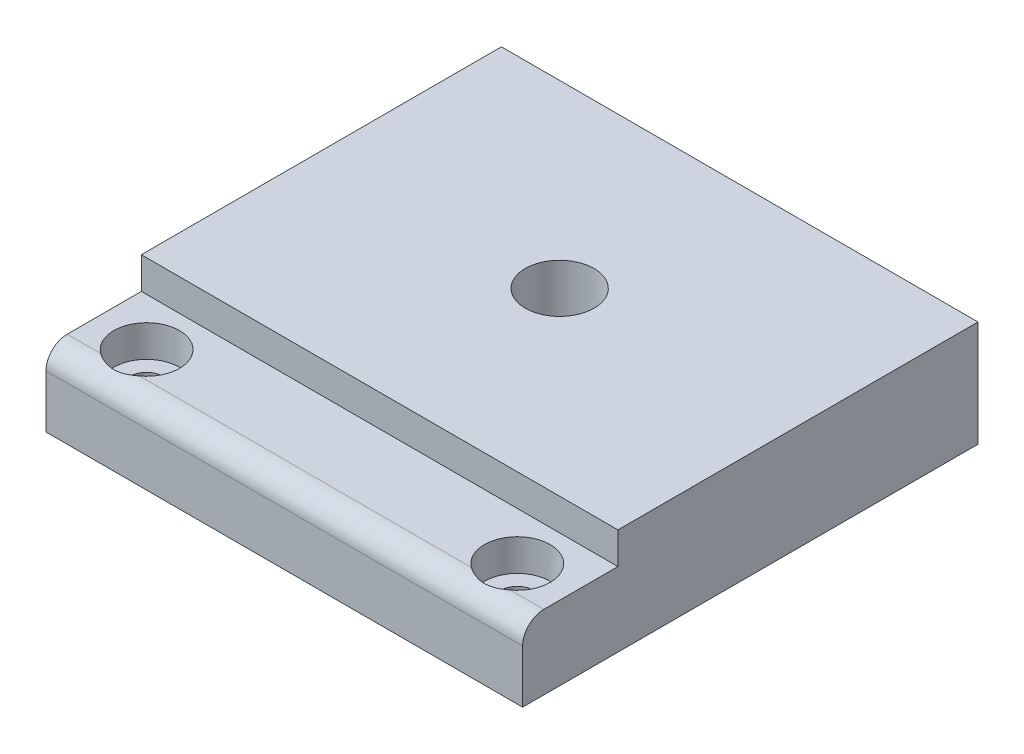
ISO-10303-21;
HEADER;
FILE_DESCRIPTION(('STEP AP214'),'2;1');
FILE_NAME('part.step','',(''),(''),'','','');
FILE_SCHEMA(('AUTOMOTIVE_DESIGN { 1 0 10303 214 1 1 1 1 }'));
ENDSEC;
DATA;
#1=APPLICATION_CONTEXT('core data for automotive mechanical design processes');
#2=APPLICATION_PROTOCOL_DEFINITION('international standard','automotive_design',2000,#1);
#3=PRODUCT_CONTEXT('',#1,'mechanical');
#4=PRODUCT('Part','Part','',(#3));
#5=PRODUCT_RELATED_PRODUCT_CATEGORY('part','',(#4));
#6=PRODUCT_DEFINITION_FORMATION('','',#4);
#7=PRODUCT_DEFINITION_CONTEXT('part definition',#1,'design');
#8=PRODUCT_DEFINITION('design','',#6,#7);
#9=PRODUCT_DEFINITION_SHAPE('','',#8);
#10=(LENGTH_UNIT() NAMED_UNIT(*) SI_UNIT(.MILLI.,.METRE.));
#11=(NAMED_UNIT(*) PLANE_ANGLE_UNIT() SI_UNIT($,.RADIAN.));
#12=(NAMED_UNIT(*) SI_UNIT($,.STERADIAN.) SOLID_ANGLE_UNIT());
#13=UNCERTAINTY_MEASURE_WITH_UNIT(LENGTH_MEASURE(1.E-05),#10,'distance_accuracy_value','');
#14=(GEOMETRIC_REPRESENTATION_CONTEXT(3) GLOBAL_UNCERTAINTY_ASSIGNED_CONTEXT((#13)) GLOBAL_UNIT_ASSIGNED_CONTEXT((#10,
#11,#12)) REPRESENTATION_CONTEXT('',''));
#15=CARTESIAN_POINT('',(0.,0.,0.));
#16=DIRECTION('',(0.,0.,1.));
#17=DIRECTION('',(1.,0.,0.));
#18=AXIS2_PLACEMENT_3D('',#15,#16,#17);
#19=CARTESIAN_POINT('',(40.,-8.50000000000001,8.5));
#20=DIRECTION('',(0.,1.,0.));
#21=DIRECTION('',(-1.,0.,0.));
#22=AXIS2_PLACEMENT_3D('',#19,#20,#21);
#23=CYLINDRICAL_SURFACE('',#22,1.6);
#24=CARTESIAN_POINT('',(40.,-8.50000000000001,8.5));
#25=DIRECTION('',(0.,-1.,0.));
#26=DIRECTION('',(1.,0.,0.));
#27=AXIS2_PLACEMENT_3D('',#24,#25,#26);
#28=CIRCLE('',#27,1.6);
#29=CARTESIAN_POINT('',(41.6,-8.50000000000001,8.5));
#30=VERTEX_POINT('',#29);
#31=EDGE_CURVE('E162',#30,#30,#28,.T.);
#32=ORIENTED_EDGE('',*,*,#31,.T.);
#33=EDGE_LOOP('',(#32));
#34=FACE_BOUND('',#33,.T.);
#35=CARTESIAN_POINT('',(40.,-4.50000000000001,8.5));
#36=DIRECTION('',(0.,1.,0.));
#37=DIRECTION('',(-1.,0.,0.));
#38=AXIS2_PLACEMENT_3D('',#35,#36,#37);
#39=CIRCLE('',#38,1.6);
#40=CARTESIAN_POINT('',(38.4,-4.50000000000001,8.5));
#41=VERTEX_POINT('',#40);
#42=EDGE_CURVE('E186',#41,#41,#39,.T.);
#43=ORIENTED_EDGE('',*,*,#42,.T.);
#44=EDGE_LOOP('',(#43));
#45=FACE_BOUND('',#44,.T.);
#46=ADVANCED_FACE('F39',(#34,#45),#23,.F.);
#47=CARTESIAN_POINT('',(5.,-8.50000000000001,8.5));
#48=DIRECTION('',(0.,1.,0.));
#49=DIRECTION('',(-1.,0.,0.));
#50=AXIS2_PLACEMENT_3D('',#47,#48,#49);
#51=CYLINDRICAL_SURFACE('',#50,1.6);
#52=CARTESIAN_POINT('',(5.,-8.50000000000001,8.5));
#53=DIRECTION('',(0.,-1.,0.));
#54=DIRECTION('',(1.,0.,0.));
#55=AXIS2_PLACEMENT_3D('',#52,#53,#54);
#56=CIRCLE('',#55,1.6);
#57=CARTESIAN_POINT('',(6.6,-8.50000000000001,8.5));
#58=VERTEX_POINT('',#57);
#59=EDGE_CURVE('E159',#58,#58,#56,.T.);
#60=ORIENTED_EDGE('',*,*,#59,.T.);
#61=EDGE_LOOP('',(#60));
#62=FACE_BOUND('',#61,.T.);
#63=CARTESIAN_POINT('',(5.,-4.50000000000001,8.5));
#64=DIRECTION('',(0.,1.,0.));
#65=DIRECTION('',(-1.,0.,0.));
#66=AXIS2_PLACEMENT_3D('',#63,#64,#65);
#67=CIRCLE('',#66,1.6);
#68=CARTESIAN_POINT('',(3.4,-4.50000000000001,8.5));
#69=VERTEX_POINT('',#68);
#70=EDGE_CURVE('E157',#69,#69,#67,.T.);
#71=ORIENTED_EDGE('',*,*,#70,.T.);
#72=EDGE_LOOP('',(#71));
#73=FACE_BOUND('',#72,.T.);
#74=ADVANCED_FACE('F235',(#62,#73),#51,.F.);
#75=CARTESIAN_POINT('',(44.9999999999998,-1.50000000000001,4.));
#76=DIRECTION('',(-1.,0.,0.));
#77=DIRECTION('',(0.,0.,1.));
#78=AXIS2_PLACEMENT_3D('',#75,#76,#77);
#79=PLANE('',#78);
#80=DIRECTION('',(0.,0.,1.));
#81=VECTOR('',#80,1.);
#82=CARTESIAN_POINT('',(45.,-1.50000000000001,0.));
#83=LINE('',#82,#81);
#84=CARTESIAN_POINT('',(44.9999999999998,-1.50000000000001,4.));
#85=VERTEX_POINT('',#84);
#86=CARTESIAN_POINT('',(45.,-1.50000000000001,11.));
#87=VERTEX_POINT('',#86);
#88=EDGE_CURVE('E170',#85,#87,#83,.T.);
#89=ORIENTED_EDGE('',*,*,#88,.T.);
#90=CARTESIAN_POINT('',(44.9999999999998,-3.50000000000001,11.));
#91=DIRECTION('',(-1.,0.,0.));
#92=DIRECTION('',(0.,0.,1.));
#93=AXIS2_PLACEMENT_3D('',#90,#91,#92);
#94=CIRCLE('',#93,2.);
#95=CARTESIAN_POINT('',(45.,-3.50000000000001,13.));
#96=VERTEX_POINT('',#95);
#97=EDGE_CURVE('E11',#87,#96,#94,.F.);
#98=ORIENTED_EDGE('',*,*,#97,.T.);
#99=DIRECTION('',(0.,1.,0.));
#100=VECTOR('',#99,1.);
#101=CARTESIAN_POINT('',(45.,-8.50000000000001,13.));
#102=LINE('',#101,#100);
#103=CARTESIAN_POINT('',(45.,-8.50000000000001,13.));
#104=VERTEX_POINT('',#103);
#105=EDGE_CURVE('E119',#104,#96,#102,.T.);
#106=ORIENTED_EDGE('',*,*,#105,.F.);
#107=DIRECTION('',(0.,0.,1.));
#108=VECTOR('',#107,1.);
#109=CARTESIAN_POINT('',(45.,-8.50000000000001,0.));
#110=LINE('',#109,#108);
#111=CARTESIAN_POINT('',(44.9999999999998,-8.50000000000001,-30.));
#112=VERTEX_POINT('',#111);
#113=EDGE_CURVE('E113',#112,#104,#110,.T.);
#114=ORIENTED_EDGE('',*,*,#113,.F.);
#115=DIRECTION('',(0.,1.,0.));
#116=VECTOR('',#115,1.);
#117=CARTESIAN_POINT('',(44.9999999999998,1.50000000000001,-30.));
#118=LINE('',#117,#116);
#119=CARTESIAN_POINT('',(44.9999999999998,1.50000000000001,-30.));
#120=VERTEX_POINT('',#119);
#121=EDGE_CURVE('E117',#112,#120,#118,.T.);
#122=ORIENTED_EDGE('',*,*,#121,.T.);
#123=DIRECTION('',(0.,0.,-1.));
#124=VECTOR('',#123,1.);
#125=CARTESIAN_POINT('',(44.9999999999998,1.50000000000001,4.));
#126=LINE('',#125,#124);
#127=CARTESIAN_POINT('',(44.9999999999998,1.50000000000001,4.));
#128=VERTEX_POINT('',#127);
#129=EDGE_CURVE('E183',#128,#120,#126,.T.);
#130=ORIENTED_EDGE('',*,*,#129,.F.);
#131=DIRECTION('',(0.,1.,0.));
#132=VECTOR('',#131,1.);
#133=CARTESIAN_POINT('',(44.9999999999998,-1.50000000000001,4.));
#134=LINE('',#133,#132);
#135=EDGE_CURVE('E177',#85,#128,#134,.T.);
#136=ORIENTED_EDGE('',*,*,#135,.F.);
#137=EDGE_LOOP('',(#89,#98,#106,#114,#122,#130,#136));
#138=FACE_BOUND('',#137,.T.);
#139=ADVANCED_FACE('F114',(#138),#79,.F.);
#140=CARTESIAN_POINT('',(44.9999999999998,1.50000000000001,4.));
#141=DIRECTION('',(0.,-1.,0.));
#142=DIRECTION('',(1.,0.,0.));
#143=AXIS2_PLACEMENT_3D('',#140,#141,#142);
#144=PLANE('',#143);
#145=CARTESIAN_POINT('',(22.4999999999999,1.50000000000001,-13.));
#146=DIRECTION('',(0.,-1.,0.));
#147=DIRECTION('',(1.,0.,0.));
#148=AXIS2_PLACEMENT_3D('',#145,#146,#147);
#149=CIRCLE('',#148,3.25);
#150=CARTESIAN_POINT('',(25.7499999999999,1.50000000000001,-13.));
#151=VERTEX_POINT('',#150);
#152=EDGE_CURVE('E139',#151,#151,#149,.T.);
#153=ORIENTED_EDGE('',*,*,#152,.T.);
#154=EDGE_LOOP('',(#153));
#155=FACE_BOUND('',#154,.T.);
#156=ORIENTED_EDGE('',*,*,#129,.T.);
#157=DIRECTION('',(1.,0.,0.));
#158=VECTOR('',#157,1.);
#159=CARTESIAN_POINT('',(-31.6227766016838,1.50000000000001,-30.));
#160=LINE('',#159,#158);
#161=CARTESIAN_POINT('',(0.,1.50000000000001,-30.));
#162=VERTEX_POINT('',#161);
#163=EDGE_CURVE('E131',#162,#120,#160,.T.);
#164=ORIENTED_EDGE('',*,*,#163,.F.);
#165=DIRECTION('',(0.,0.,1.));
#166=VECTOR('',#165,1.);
#167=CARTESIAN_POINT('',(0.,1.49999999999998,0.));
#168=LINE('',#167,#166);
#169=CARTESIAN_POINT('',(0.,1.49999999999998,4.));
#170=VERTEX_POINT('',#169);
#171=EDGE_CURVE('E146',#162,#170,#168,.T.);
#172=ORIENTED_EDGE('',*,*,#171,.T.);
#173=DIRECTION('',(-1.,0.,0.));
#174=VECTOR('',#173,1.);
#175=CARTESIAN_POINT('',(44.9999999999998,1.50000000000001,4.));
#176=LINE('',#175,#174);
#177=EDGE_CURVE('E181',#128,#170,#176,.T.);
#178=ORIENTED_EDGE('',*,*,#177,.F.);
#179=EDGE_LOOP('',(#156,#164,#172,#178));
#180=FACE_BOUND('',#179,.T.);
#181=ADVANCED_FACE('F253',(#155,#180),#144,.F.);
#182=CARTESIAN_POINT('',(0.,0.,4.));
#183=DIRECTION('',(0.,0.,1.));
#184=DIRECTION('',(1.,0.,0.));
#185=AXIS2_PLACEMENT_3D('',#182,#183,#184);
#186=PLANE('',#185);
#187=DIRECTION('',(0.,1.,0.));
#188=VECTOR('',#187,1.);
#189=CARTESIAN_POINT('',(0.,-1.50000000000002,4.));
#190=LINE('',#189,#188);
#191=CARTESIAN_POINT('',(0.,-1.50000000000002,4.));
#192=VERTEX_POINT('',#191);
#193=EDGE_CURVE('E150',#192,#170,#190,.T.);
#194=ORIENTED_EDGE('',*,*,#193,.F.);
#195=DIRECTION('',(1.,0.,0.));
#196=VECTOR('',#195,1.);
#197=CARTESIAN_POINT('',(44.9999999999998,-1.50000000000001,4.));
#198=LINE('',#197,#196);
#199=EDGE_CURVE('E180',#192,#85,#198,.T.);
#200=ORIENTED_EDGE('',*,*,#199,.T.);
#201=ORIENTED_EDGE('',*,*,#135,.T.);
#202=ORIENTED_EDGE('',*,*,#177,.T.);
#203=EDGE_LOOP('',(#194,#200,#201,#202));
#204=FACE_BOUND('',#203,.T.);
#205=ADVANCED_FACE('F246',(#204),#186,.T.);
#206=CARTESIAN_POINT('',(0.,-1.50000000000002,0.));
#207=DIRECTION('',(0.,1.,0.));
#208=DIRECTION('',(-1.,0.,0.));
#209=AXIS2_PLACEMENT_3D('',#206,#207,#208);
#210=PLANE('',#209);
#211=DIRECTION('',(0.,0.,-1.));
#212=VECTOR('',#211,1.);
#213=CARTESIAN_POINT('',(0.,-1.50000000000002,0.));
#214=LINE('',#213,#212);
#215=CARTESIAN_POINT('',(0.,-1.50000000000002,11.));
#216=VERTEX_POINT('',#215);
#217=EDGE_CURVE('E168',#216,#192,#214,.T.);
#218=ORIENTED_EDGE('',*,*,#217,.F.);
#219=DIRECTION('',(-1.,0.,0.));
#220=VECTOR('',#219,1.);
#221=CARTESIAN_POINT('',(45.,-1.50000000000001,11.));
#222=LINE('',#221,#220);
#223=CARTESIAN_POINT('',(3.16696972201767,-1.50000000000002,11.));
#224=VERTEX_POINT('',#223);
#225=EDGE_CURVE('E202',#216,#224,#222,.F.);
#226=ORIENTED_EDGE('',*,*,#225,.T.);
#227=CARTESIAN_POINT('',(5.,-1.50000000000002,8.5));
#228=DIRECTION('',(0.,1.,0.));
#229=DIRECTION('',(-1.,0.,0.));
#230=AXIS2_PLACEMENT_3D('',#227,#228,#229);
#231=CIRCLE('',#230,3.1);
#232=CARTESIAN_POINT('',(6.83303027798233,-1.50000000000002,11.));
#233=VERTEX_POINT('',#232);
#234=EDGE_CURVE('E161',#224,#233,#231,.F.);
#235=ORIENTED_EDGE('',*,*,#234,.T.);
#236=DIRECTION('',(-1.,0.,0.));
#237=VECTOR('',#236,1.);
#238=CARTESIAN_POINT('',(45.,-1.50000000000001,11.));
#239=LINE('',#238,#237);
#240=CARTESIAN_POINT('',(38.1669697220176,-1.50000000000001,11.));
#241=VERTEX_POINT('',#240);
#242=EDGE_CURVE('E65',#233,#241,#239,.F.);
#243=ORIENTED_EDGE('',*,*,#242,.T.);
#244=CARTESIAN_POINT('',(40.,-1.50000000000001,8.5));
#245=DIRECTION('',(0.,1.,0.));
#246=DIRECTION('',(-1.,0.,0.));
#247=AXIS2_PLACEMENT_3D('',#244,#245,#246);
#248=CIRCLE('',#247,3.1);
#249=CARTESIAN_POINT('',(41.8330302779823,-1.50000000000001,11.));
#250=VERTEX_POINT('',#249);
#251=EDGE_CURVE('E195',#241,#250,#248,.F.);
#252=ORIENTED_EDGE('',*,*,#251,.T.);
#253=DIRECTION('',(-1.,0.,0.));
#254=VECTOR('',#253,1.);
#255=CARTESIAN_POINT('',(45.,-1.50000000000001,11.));
#256=LINE('',#255,#254);
#257=EDGE_CURVE('E57',#250,#87,#256,.F.);
#258=ORIENTED_EDGE('',*,*,#257,.T.);
#259=ORIENTED_EDGE('',*,*,#88,.F.);
#260=ORIENTED_EDGE('',*,*,#199,.F.);
#261=EDGE_LOOP('',(#218,#226,#235,#243,#252,#258,#259,#260));
#262=FACE_BOUND('',#261,.T.);
#263=ADVANCED_FACE('F245',(#262),#210,.T.);
#264=CARTESIAN_POINT('',(0.,-8.50000000000001,0.));
#265=DIRECTION('',(0.,1.,0.));
#266=DIRECTION('',(-1.,0.,0.));
#267=AXIS2_PLACEMENT_3D('',#264,#265,#266);
#268=PLANE('',#267);
#269=CARTESIAN_POINT('',(22.4999999999999,-8.50000000000001,-13.));
#270=DIRECTION('',(0.,1.,0.));
#271=DIRECTION('',(-1.,0.,0.));
#272=AXIS2_PLACEMENT_3D('',#269,#270,#271);
#273=CIRCLE('',#272,8.5);
#274=CARTESIAN_POINT('',(13.9999999999999,-8.50000000000001,-13.));
#275=VERTEX_POINT('',#274);
#276=EDGE_CURVE('E429',#275,#275,#273,.T.);
#277=ORIENTED_EDGE('',*,*,#276,.T.);
#278=EDGE_LOOP('',(#277));
#279=FACE_BOUND('',#278,.T.);
#280=DIRECTION('',(0.,0.,-1.));
#281=VECTOR('',#280,1.);
#282=CARTESIAN_POINT('',(0.,-8.50000000000001,0.));
#283=LINE('',#282,#281);
#284=CARTESIAN_POINT('',(0.,-8.50000000000001,13.));
#285=VERTEX_POINT('',#284);
#286=CARTESIAN_POINT('',(0.,-8.50000000000001,-30.));
#287=VERTEX_POINT('',#286);
#288=EDGE_CURVE('E121',#285,#287,#283,.T.);
#289=ORIENTED_EDGE('',*,*,#288,.T.);
#290=DIRECTION('',(1.,0.,0.));
#291=VECTOR('',#290,1.);
#292=CARTESIAN_POINT('',(-31.6227766016838,-8.50000000000001,-30.));
#293=LINE('',#292,#291);
#294=EDGE_CURVE('E130',#287,#112,#293,.T.);
#295=ORIENTED_EDGE('',*,*,#294,.T.);
#296=ORIENTED_EDGE('',*,*,#113,.T.);
#297=DIRECTION('',(-1.,0.,0.));
#298=VECTOR('',#297,1.);
#299=CARTESIAN_POINT('',(0.,-8.50000000000001,13.));
#300=LINE('',#299,#298);
#301=EDGE_CURVE('E124',#104,#285,#300,.T.);
#302=ORIENTED_EDGE('',*,*,#301,.T.);
#303=EDGE_LOOP('',(#289,#295,#296,#302));
#304=FACE_BOUND('',#303,.T.);
#305=ORIENTED_EDGE('',*,*,#31,.F.);
#306=EDGE_LOOP('',(#305));
#307=FACE_BOUND('',#306,.T.);
#308=ORIENTED_EDGE('',*,*,#59,.F.);
#309=EDGE_LOOP('',(#308));
#310=FACE_BOUND('',#309,.T.);
#311=ADVANCED_FACE('F129',(#279,#304,#307,#310),#268,.F.);
#312=CARTESIAN_POINT('',(0.,-8.50000000000001,0.));
#313=DIRECTION('',(1.,0.,0.));
#314=DIRECTION('',(0.,1.,0.));
#315=AXIS2_PLACEMENT_3D('',#312,#313,#314);
#316=PLANE('',#315);
#317=DIRECTION('',(0.,1.,0.));
#318=VECTOR('',#317,1.);
#319=CARTESIAN_POINT('',(0.,-8.50000000000001,13.));
#320=LINE('',#319,#318);
#321=CARTESIAN_POINT('',(0.,-3.50000000000002,13.));
#322=VERTEX_POINT('',#321);
#323=EDGE_CURVE('E167',#285,#322,#320,.T.);
#324=ORIENTED_EDGE('',*,*,#323,.T.);
#325=CARTESIAN_POINT('',(0.,-3.50000000000002,11.));
#326=DIRECTION('',(1.,0.,0.));
#327=DIRECTION('',(0.,1.,0.));
#328=AXIS2_PLACEMENT_3D('',#325,#326,#327);
#329=CIRCLE('',#328,2.);
#330=EDGE_CURVE('E199',#322,#216,#329,.F.);
#331=ORIENTED_EDGE('',*,*,#330,.T.);
#332=ORIENTED_EDGE('',*,*,#217,.T.);
#333=ORIENTED_EDGE('',*,*,#193,.T.);
#334=ORIENTED_EDGE('',*,*,#171,.F.);
#335=DIRECTION('',(0.,-1.,0.));
#336=VECTOR('',#335,1.);
#337=CARTESIAN_POINT('',(0.,1.50000000000001,-30.));
#338=LINE('',#337,#336);
#339=EDGE_CURVE('E143',#162,#287,#338,.T.);
#340=ORIENTED_EDGE('',*,*,#339,.T.);
#341=ORIENTED_EDGE('',*,*,#288,.F.);
#342=EDGE_LOOP('',(#324,#331,#332,#333,#334,#340,#341));
#343=FACE_BOUND('',#342,.T.);
#344=ADVANCED_FACE('F241',(#343),#316,.F.);
#345=CARTESIAN_POINT('',(0.,-8.50000000000001,13.));
#346=DIRECTION('',(0.,0.,-1.));
#347=DIRECTION('',(-1.,0.,0.));
#348=AXIS2_PLACEMENT_3D('',#345,#346,#347);
#349=PLANE('',#348);
#350=ORIENTED_EDGE('',*,*,#105,.T.);
#351=DIRECTION('',(-1.,0.,0.));
#352=VECTOR('',#351,1.);
#353=CARTESIAN_POINT('',(0.,-3.50000000000002,13.));
#354=LINE('',#353,#352);
#355=EDGE_CURVE('E187',#96,#322,#354,.T.);
#356=ORIENTED_EDGE('',*,*,#355,.T.);
#357=ORIENTED_EDGE('',*,*,#323,.F.);
#358=ORIENTED_EDGE('',*,*,#301,.F.);
#359=EDGE_LOOP('',(#350,#356,#357,#358));
#360=FACE_BOUND('',#359,.T.);
#361=ADVANCED_FACE('F218',(#360),#349,.F.);
#362=CARTESIAN_POINT('',(5.,8.49999999999999,8.5));
#363=DIRECTION('',(0.,-1.,0.));
#364=DIRECTION('',(1.,0.,0.));
#365=AXIS2_PLACEMENT_3D('',#362,#363,#364);
#366=CYLINDRICAL_SURFACE('',#365,3.1);
#367=ORIENTED_EDGE('',*,*,#234,.F.);
#368=CARTESIAN_POINT('',(3.16696972201767,-1.50000000000002,11.));
#369=CARTESIAN_POINT('',(3.23550505387794,-1.50001735310107,11.0502621628509));
#370=CARTESIAN_POINT('',(3.30608180454966,-1.50189440953277,11.0976653313171));
#371=CARTESIAN_POINT('',(3.4507618431863,-1.50820895949627,11.1864558724982));
#372=CARTESIAN_POINT('',(3.52486295209728,-1.51264488932473,11.227846899856));
#373=CARTESIAN_POINT('',(3.67622051889832,-1.52292786912718,11.3044280654658));
#374=CARTESIAN_POINT('',(3.75348102670088,-1.52877678065447,11.3396099166452));
#375=CARTESIAN_POINT('',(3.91061072920125,-1.5408594909649,11.4035192543654));
#376=CARTESIAN_POINT('',(3.99048030345446,-1.54709334586638,11.4322457969841));
#377=CARTESIAN_POINT('',(4.15233627726538,-1.5590382551732,11.4830622885839));
#378=CARTESIAN_POINT('',(4.2343225085791,-1.56474935096739,11.5051527632847));
#379=CARTESIAN_POINT('',(4.3999050565945,-1.57489750688101,11.5425464402473));
#380=CARTESIAN_POINT('',(4.48350128615747,-1.57933463574634,11.5578500087689));
#381=CARTESIAN_POINT('',(4.65161438004655,-1.58637072501005,11.5815290403547));
#382=CARTESIAN_POINT('',(4.73612958349864,-1.58897257491355,11.5899153975759));
#383=CARTESIAN_POINT('',(4.90560261435766,-1.59202801311554,11.5997246712777));
#384=CARTESIAN_POINT('',(4.99056043637087,-1.59248162753122,11.6011476724153));
#385=CARTESIAN_POINT('',(5.16025288087581,-1.59118512215258,11.5970178097625));
#386=CARTESIAN_POINT('',(5.24498758218977,-1.58943592878967,11.5914678785695));
#387=CARTESIAN_POINT('',(5.41365361993897,-1.58395065389731,11.5734483225564));
#388=CARTESIAN_POINT('',(5.49758492470417,-1.58021449436695,11.5609784260834));
#389=CARTESIAN_POINT('',(5.66416846991037,-1.57121421119516,11.5292045813922));
#390=CARTESIAN_POINT('',(5.7468189188676,-1.56594812084915,11.5098918297187));
#391=CARTESIAN_POINT('',(5.9102042593073,-1.55456594784192,11.4645766978594));
#392=CARTESIAN_POINT('',(5.99093917758513,-1.54844987707887,11.4385744113104));
#393=CARTESIAN_POINT('',(6.13836436960853,-1.53710924450286,11.3843303381701));
#394=CARTESIAN_POINT('',(6.20538163272571,-1.53188513487457,11.3569724442662));
#395=CARTESIAN_POINT('',(6.33736212538811,-1.52204032464187,11.2976234016654));
#396=CARTESIAN_POINT('',(6.40232585215937,-1.51741947710723,11.2656333851847));
#397=CARTESIAN_POINT('',(6.52979659717762,-1.50944876227795,11.1972100111978));
#398=CARTESIAN_POINT('',(6.59230809431974,-1.50609647088554,11.1607853059316));
#399=CARTESIAN_POINT('',(6.71471986971853,-1.50137596702926,11.0835989341526));
#400=CARTESIAN_POINT('',(6.77461856769173,-1.50000893959365,11.0428346928849));
#401=CARTESIAN_POINT('',(6.83303027798234,-1.50000000000001,11.));
#402=B_SPLINE_CURVE_WITH_KNOTS('',3,(#368,#369,#370,#371,#372,#373,#374,#375,#376,#377,#378,
#379,#380,#381,#382,#383,#384,#385,#386,#387,#388,#389,#390,#391,#392,#393,#394,#395,#396,#397,
#398,#399,#400,#401),.UNSPECIFIED.,.F.,.F.,(4,2,2,2,2,2,2,2,2,2,2,2,2,2,2,2,4),(0.,
0.254817439620147,0.509479327423225,0.764478570696376,1.01951507679293,1.2745313731673,
1.52953390574458,1.78413405493536,2.03873110881429,2.29322112295979,2.54772112817428,
2.80254974819496,3.05737480144623,3.27492648131137,3.49242507514365,3.70950592415545,
3.9267162981878),.UNSPECIFIED.);
#403=EDGE_CURVE('E203',#224,#233,#402,.T.);
#404=ORIENTED_EDGE('',*,*,#403,.T.);
#405=EDGE_LOOP('',(#367,#404));
#406=FACE_BOUND('',#405,.T.);
#407=CARTESIAN_POINT('',(5.,-4.50000000000001,8.5));
#408=DIRECTION('',(0.,1.,0.));
#409=DIRECTION('',(-1.,0.,0.));
#410=AXIS2_PLACEMENT_3D('',#407,#408,#409);
#411=CIRCLE('',#410,3.1);
#412=CARTESIAN_POINT('',(1.9,-4.50000000000001,8.5));
#413=VERTEX_POINT('',#412);
#414=EDGE_CURVE('E155',#413,#413,#411,.T.);
#415=ORIENTED_EDGE('',*,*,#414,.F.);
#416=EDGE_LOOP('',(#415));
#417=FACE_BOUND('',#416,.T.);
#418=ADVANCED_FACE('F213',(#406,#417),#366,.F.);
#419=CARTESIAN_POINT('',(5.,-4.50000000000001,8.5));
#420=DIRECTION('',(0.,1.,0.));
#421=DIRECTION('',(-1.,0.,0.));
#422=AXIS2_PLACEMENT_3D('',#419,#420,#421);
#423=PLANE('',#422);
#424=ORIENTED_EDGE('',*,*,#70,.F.);
#425=EDGE_LOOP('',(#424));
#426=FACE_BOUND('',#425,.T.);
#427=ORIENTED_EDGE('',*,*,#414,.T.);
#428=EDGE_LOOP('',(#427));
#429=FACE_BOUND('',#428,.T.);
#430=ADVANCED_FACE('F216',(#426,#429),#423,.T.);
#431=CARTESIAN_POINT('',(40.,8.49999999999999,8.5));
#432=DIRECTION('',(0.,-1.,0.));
#433=DIRECTION('',(1.,0.,0.));
#434=AXIS2_PLACEMENT_3D('',#431,#432,#433);
#435=CYLINDRICAL_SURFACE('',#434,3.1);
#436=ORIENTED_EDGE('',*,*,#251,.F.);
#437=CARTESIAN_POINT('',(38.1669697220176,-1.50000000000001,11.));
#438=CARTESIAN_POINT('',(38.2355050538779,-1.50001735310107,11.0502621628509));
#439=CARTESIAN_POINT('',(38.3060818045496,-1.50189440953277,11.0976653313171));
#440=CARTESIAN_POINT('',(38.4507618431863,-1.50820895949627,11.1864558724982));
#441=CARTESIAN_POINT('',(38.5248629520973,-1.51264488932473,11.227846899856));
#442=CARTESIAN_POINT('',(38.6762205188983,-1.52292786912718,11.3044280654658));
#443=CARTESIAN_POINT('',(38.7534810267009,-1.52877678065447,11.3396099166452));
#444=CARTESIAN_POINT('',(38.9106107292012,-1.54085949096489,11.4035192543654));
#445=CARTESIAN_POINT('',(38.9904803034544,-1.54709334586638,11.4322457969841));
#446=CARTESIAN_POINT('',(39.1523362772654,-1.5590382551732,11.4830622885839));
#447=CARTESIAN_POINT('',(39.2343225085791,-1.56474935096739,11.5051527632847));
#448=CARTESIAN_POINT('',(39.3999050565945,-1.574897506881,11.5425464402472));
#449=CARTESIAN_POINT('',(39.4835012861574,-1.57933463574633,11.5578500087689));
#450=CARTESIAN_POINT('',(39.6516143800465,-1.58637072501004,11.5815290403547));
#451=CARTESIAN_POINT('',(39.7361295834986,-1.58897257491354,11.5899153975759));
#452=CARTESIAN_POINT('',(39.9056026143576,-1.59202801311553,11.5997246712777));
#453=CARTESIAN_POINT('',(39.9905604363708,-1.59248162753122,11.6011476724153));
#454=CARTESIAN_POINT('',(40.1602528808758,-1.59118512215258,11.5970178097625));
#455=CARTESIAN_POINT('',(40.2449875821898,-1.58943592878967,11.5914678785695));
#456=CARTESIAN_POINT('',(40.4136536199389,-1.5839506538973,11.5734483225564));
#457=CARTESIAN_POINT('',(40.4975849247041,-1.58021449436694,11.5609784260834));
#458=CARTESIAN_POINT('',(40.6641684699104,-1.57121421119516,11.5292045813922));
#459=CARTESIAN_POINT('',(40.7468189188676,-1.56594812084915,11.5098918297187));
#460=CARTESIAN_POINT('',(40.9102042593073,-1.55456594784192,11.4645766978594));
#461=CARTESIAN_POINT('',(40.9909391775851,-1.54844987707886,11.4385744113104));
#462=CARTESIAN_POINT('',(41.1383643696085,-1.53710924450285,11.3843303381701));
#463=CARTESIAN_POINT('',(41.2053816327257,-1.53188513487457,11.3569724442662));
#464=CARTESIAN_POINT('',(41.3373621253881,-1.52204032464187,11.2976234016654));
#465=CARTESIAN_POINT('',(41.4023258521594,-1.51741947710722,11.2656333851847));
#466=CARTESIAN_POINT('',(41.5297965971776,-1.50944876227795,11.1972100111978));
#467=CARTESIAN_POINT('',(41.5923080943197,-1.50609647088554,11.1607853059316));
#468=CARTESIAN_POINT('',(41.7147198697185,-1.50137596702926,11.0835989341526));
#469=CARTESIAN_POINT('',(41.7746185676917,-1.50000893959364,11.0428346928849));
#470=CARTESIAN_POINT('',(41.8330302779823,-1.50000000000001,11.));
#471=B_SPLINE_CURVE_WITH_KNOTS('',3,(#437,#438,#439,#440,#441,#442,#443,#444,#445,#446,#447,
#448,#449,#450,#451,#452,#453,#454,#455,#456,#457,#458,#459,#460,#461,#462,#463,#464,#465,#466,
#467,#468,#469,#470),.UNSPECIFIED.,.F.,.F.,(4,2,2,2,2,2,2,2,2,2,2,2,2,2,2,2,4),(0.,
0.25481743962015,0.509479327423223,0.764478570696373,1.01951507679293,1.27453137316729,
1.52953390574458,1.78413405493536,2.0387311088143,2.2932211229598,2.54772112817428,
2.80254974819496,3.05737480144623,3.27492648131137,3.49242507514365,3.70950592415545,
3.9267162981878),.UNSPECIFIED.);
#472=EDGE_CURVE('E47',#241,#250,#471,.T.);
#473=ORIENTED_EDGE('',*,*,#472,.T.);
#474=EDGE_LOOP('',(#436,#473));
#475=FACE_BOUND('',#474,.T.);
#476=CARTESIAN_POINT('',(40.,-4.50000000000001,8.5));
#477=DIRECTION('',(0.,1.,0.));
#478=DIRECTION('',(-1.,0.,0.));
#479=AXIS2_PLACEMENT_3D('',#476,#477,#478);
#480=CIRCLE('',#479,3.1);
#481=CARTESIAN_POINT('',(36.9,-4.50000000000001,8.5));
#482=VERTEX_POINT('',#481);
#483=EDGE_CURVE('E154',#482,#482,#480,.T.);
#484=ORIENTED_EDGE('',*,*,#483,.F.);
#485=EDGE_LOOP('',(#484));
#486=FACE_BOUND('',#485,.T.);
#487=ADVANCED_FACE('F223',(#475,#486),#435,.F.);
#488=CARTESIAN_POINT('',(40.,-4.50000000000001,8.5));
#489=DIRECTION('',(0.,1.,0.));
#490=DIRECTION('',(-1.,0.,0.));
#491=AXIS2_PLACEMENT_3D('',#488,#489,#490);
#492=PLANE('',#491);
#493=ORIENTED_EDGE('',*,*,#42,.F.);
#494=EDGE_LOOP('',(#493));
#495=FACE_BOUND('',#494,.T.);
#496=ORIENTED_EDGE('',*,*,#483,.T.);
#497=EDGE_LOOP('',(#496));
#498=FACE_BOUND('',#497,.T.);
#499=ADVANCED_FACE('F227',(#495,#498),#492,.T.);
#500=CARTESIAN_POINT('',(0.,-3.50000000000002,11.));
#501=DIRECTION('',(1.,0.,0.));
#502=DIRECTION('',(0.,1.,0.));
#503=AXIS2_PLACEMENT_3D('',#500,#501,#502);
#504=CYLINDRICAL_SURFACE('',#503,2.);
#505=ORIENTED_EDGE('',*,*,#403,.F.);
#506=ORIENTED_EDGE('',*,*,#225,.F.);
#507=ORIENTED_EDGE('',*,*,#330,.F.);
#508=ORIENTED_EDGE('',*,*,#355,.F.);
#509=ORIENTED_EDGE('',*,*,#97,.F.);
#510=ORIENTED_EDGE('',*,*,#257,.F.);
#511=ORIENTED_EDGE('',*,*,#472,.F.);
#512=ORIENTED_EDGE('',*,*,#242,.F.);
#513=EDGE_LOOP('',(#505,#506,#507,#508,#509,#510,#511,#512));
#514=FACE_BOUND('',#513,.T.);
#515=ADVANCED_FACE('F41',(#514),#504,.T.);
#516=CARTESIAN_POINT('',(-31.6227766016838,1.50000000000001,-30.));
#517=DIRECTION('',(0.,0.,-1.));
#518=DIRECTION('',(-1.,0.,0.));
#519=AXIS2_PLACEMENT_3D('',#516,#517,#518);
#520=PLANE('',#519);
#521=ORIENTED_EDGE('',*,*,#339,.F.);
#522=ORIENTED_EDGE('',*,*,#163,.T.);
#523=ORIENTED_EDGE('',*,*,#121,.F.);
#524=ORIENTED_EDGE('',*,*,#294,.F.);
#525=EDGE_LOOP('',(#521,#522,#523,#524));
#526=FACE_BOUND('',#525,.T.);
#527=ADVANCED_FACE('F140',(#526),#520,.T.);
#528=CARTESIAN_POINT('',(22.4999999999999,1.50000000000001,-13.));
#529=DIRECTION('',(0.,-1.,0.));
#530=DIRECTION('',(1.,0.,0.));
#531=AXIS2_PLACEMENT_3D('',#528,#529,#530);
#532=CYLINDRICAL_SURFACE('',#531,3.25);
#533=CARTESIAN_POINT('',(22.4999999999999,-5.50000000000001,-13.));
#534=DIRECTION('',(0.,1.,0.));
#535=DIRECTION('',(-1.,0.,0.));
#536=AXIS2_PLACEMENT_3D('',#533,#534,#535);
#537=CIRCLE('',#536,3.25);
#538=CARTESIAN_POINT('',(19.2499999999999,-5.50000000000001,-13.));
#539=VERTEX_POINT('',#538);
#540=EDGE_CURVE('E42',#539,#539,#537,.F.);
#541=ORIENTED_EDGE('',*,*,#540,.T.);
#542=EDGE_LOOP('',(#541));
#543=FACE_BOUND('',#542,.T.);
#544=ORIENTED_EDGE('',*,*,#152,.F.);
#545=EDGE_LOOP('',(#544));
#546=FACE_BOUND('',#545,.T.);
#547=ADVANCED_FACE('F280',(#543,#546),#532,.F.);
#548=CARTESIAN_POINT('',(22.4999999999999,-5.50000000000001,-13.));
#549=DIRECTION('',(0.,1.,0.));
#550=DIRECTION('',(-1.,0.,0.));
#551=AXIS2_PLACEMENT_3D('',#548,#549,#550);
#552=PLANE('',#551);
#553=CARTESIAN_POINT('',(22.4999999999999,-5.50000000000001,-13.));
#554=DIRECTION('',(0.,1.,0.));
#555=DIRECTION('',(-1.,0.,0.));
#556=AXIS2_PLACEMENT_3D('',#553,#554,#555);
#557=CIRCLE('',#556,8.5);
#558=CARTESIAN_POINT('',(13.9999999999999,-5.50000000000001,-13.));
#559=VERTEX_POINT('',#558);
#560=EDGE_CURVE('E428',#559,#559,#557,.T.);
#561=ORIENTED_EDGE('',*,*,#560,.F.);
#562=EDGE_LOOP('',(#561));
#563=FACE_BOUND('',#562,.T.);
#564=ORIENTED_EDGE('',*,*,#540,.F.);
#565=EDGE_LOOP('',(#564));
#566=FACE_BOUND('',#565,.T.);
#567=ADVANCED_FACE('F291',(#563,#566),#552,.F.);
#568=CARTESIAN_POINT('',(22.4999999999999,-5.50000000000001,-13.));
#569=DIRECTION('',(0.,-1.,0.));
#570=DIRECTION('',(1.,0.,0.));
#571=AXIS2_PLACEMENT_3D('',#568,#569,#570);
#572=CYLINDRICAL_SURFACE('',#571,8.5);
#573=ORIENTED_EDGE('',*,*,#560,.T.);
#574=EDGE_LOOP('',(#573));
#575=FACE_BOUND('',#574,.T.);
#576=ORIENTED_EDGE('',*,*,#276,.F.);
#577=EDGE_LOOP('',(#576));
#578=FACE_BOUND('',#577,.T.);
#579=ADVANCED_FACE('F305',(#575,#578),#572,.F.);
#580=CLOSED_SHELL('',(#46,#74,#139,#181,#205,#263,#311,#344,#361,#418,#430,#487,#499,#515,#527,
#547,#567,#579));
#581=MANIFOLD_SOLID_BREP('B2',#580);
#582=ADVANCED_BREP_SHAPE_REPRESENTATION('',(#18,#581),#14);
#583=SHAPE_DEFINITION_REPRESENTATION(#9,#582);
ENDSEC;
END-ISO-10303-21;
